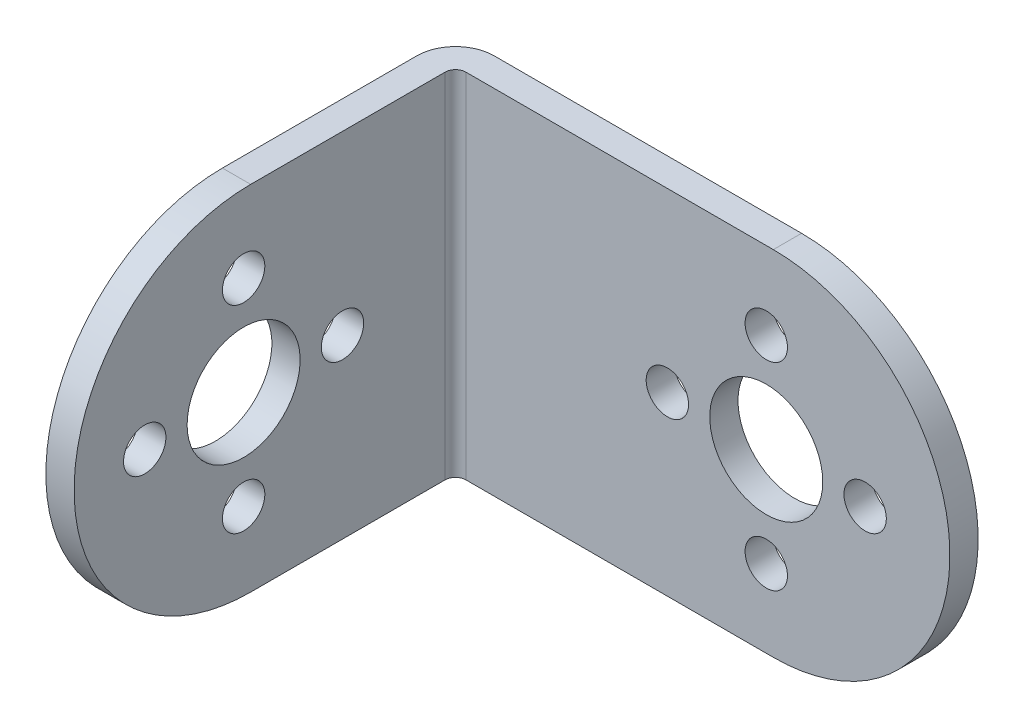
ISO-10303-21;
HEADER;
FILE_DESCRIPTION(('STEP AP214'),'2;1');
FILE_NAME('part.step','',(''),(''),'','','');
FILE_SCHEMA(('AUTOMOTIVE_DESIGN { 1 0 10303 214 1 1 1 1 }'));
ENDSEC;
DATA;
#1=APPLICATION_CONTEXT('core data for automotive mechanical design processes');
#2=APPLICATION_PROTOCOL_DEFINITION('international standard','automotive_design',2000,#1);
#3=PRODUCT_CONTEXT('',#1,'mechanical');
#4=PRODUCT('Part','Part','',(#3));
#5=PRODUCT_RELATED_PRODUCT_CATEGORY('part','',(#4));
#6=PRODUCT_DEFINITION_FORMATION('','',#4);
#7=PRODUCT_DEFINITION_CONTEXT('part definition',#1,'design');
#8=PRODUCT_DEFINITION('design','',#6,#7);
#9=PRODUCT_DEFINITION_SHAPE('','',#8);
#10=(LENGTH_UNIT() NAMED_UNIT(*) SI_UNIT(.MILLI.,.METRE.));
#11=(NAMED_UNIT(*) PLANE_ANGLE_UNIT() SI_UNIT($,.RADIAN.));
#12=(NAMED_UNIT(*) SI_UNIT($,.STERADIAN.) SOLID_ANGLE_UNIT());
#13=UNCERTAINTY_MEASURE_WITH_UNIT(LENGTH_MEASURE(1.E-05),#10,'distance_accuracy_value','');
#14=(GEOMETRIC_REPRESENTATION_CONTEXT(3) GLOBAL_UNCERTAINTY_ASSIGNED_CONTEXT((#13)) GLOBAL_UNIT_ASSIGNED_CONTEXT((#10,
#11,#12)) REPRESENTATION_CONTEXT('',''));
#15=CARTESIAN_POINT('',(0.,0.,0.));
#16=DIRECTION('',(0.,0.,1.));
#17=DIRECTION('',(1.,0.,0.));
#18=AXIS2_PLACEMENT_3D('',#15,#16,#17);
#19=CARTESIAN_POINT('',(2.,0.,0.));
#20=DIRECTION('',(-1.,0.,0.));
#21=DIRECTION('',(0.,0.,1.));
#22=AXIS2_PLACEMENT_3D('',#19,#20,#21);
#23=PLANE('',#22);
#24=CARTESIAN_POINT('',(1.99999999999995,-12.5,14.5));
#25=DIRECTION('',(-1.,0.,0.));
#26=DIRECTION('',(0.,0.,1.));
#27=AXIS2_PLACEMENT_3D('',#24,#25,#26);
#28=CIRCLE('',#27,12.5);
#29=CARTESIAN_POINT('',(1.99999999999997,-25.,14.5));
#30=VERTEX_POINT('',#29);
#31=CARTESIAN_POINT('',(1.99999999999995,0.,14.5));
#32=VERTEX_POINT('',#31);
#33=EDGE_CURVE('E79',#30,#32,#28,.T.);
#34=ORIENTED_EDGE('',*,*,#33,.F.);
#35=DIRECTION('',(0.,0.,-1.));
#36=VECTOR('',#35,1.);
#37=CARTESIAN_POINT('',(2.,-25.,0.));
#38=LINE('',#37,#36);
#39=CARTESIAN_POINT('',(2.,-25.,0.736599999999995));
#40=VERTEX_POINT('',#39);
#41=EDGE_CURVE('E84',#40,#30,#38,.F.);
#42=ORIENTED_EDGE('',*,*,#41,.F.);
#43=DIRECTION('',(0.,-1.,0.));
#44=VECTOR('',#43,1.);
#45=CARTESIAN_POINT('',(2.,-25.,0.736599999999997));
#46=LINE('',#45,#44);
#47=CARTESIAN_POINT('',(1.99999999999997,0.,0.736599999999995));
#48=VERTEX_POINT('',#47);
#49=EDGE_CURVE('E174',#40,#48,#46,.F.);
#50=ORIENTED_EDGE('',*,*,#49,.T.);
#51=DIRECTION('',(0.,0.,1.));
#52=VECTOR('',#51,1.);
#53=CARTESIAN_POINT('',(1.99999999999995,0.,28.));
#54=LINE('',#53,#52);
#55=EDGE_CURVE('E87',#32,#48,#54,.F.);
#56=ORIENTED_EDGE('',*,*,#55,.F.);
#57=EDGE_LOOP('',(#34,#42,#50,#56));
#58=FACE_BOUND('',#57,.T.);
#59=CARTESIAN_POINT('',(1.99999999999995,-19.5,15.));
#60=DIRECTION('',(-1.,0.,0.));
#61=DIRECTION('',(0.,0.,1.));
#62=AXIS2_PLACEMENT_3D('',#59,#60,#61);
#63=CIRCLE('',#62,1.5);
#64=CARTESIAN_POINT('',(1.99999999999994,-19.5,16.5));
#65=VERTEX_POINT('',#64);
#66=EDGE_CURVE('E100',#65,#65,#63,.T.);
#67=ORIENTED_EDGE('',*,*,#66,.T.);
#68=EDGE_LOOP('',(#67));
#69=FACE_BOUND('',#68,.T.);
#70=CARTESIAN_POINT('',(1.99999999999992,-12.5,22.));
#71=DIRECTION('',(-1.,0.,0.));
#72=DIRECTION('',(0.,0.,1.));
#73=AXIS2_PLACEMENT_3D('',#70,#71,#72);
#74=CIRCLE('',#73,1.5);
#75=CARTESIAN_POINT('',(1.99999999999992,-12.5,23.5));
#76=VERTEX_POINT('',#75);
#77=EDGE_CURVE('E178',#76,#76,#74,.T.);
#78=ORIENTED_EDGE('',*,*,#77,.T.);
#79=EDGE_LOOP('',(#78));
#80=FACE_BOUND('',#79,.T.);
#81=CARTESIAN_POINT('',(1.99999999999995,-12.5,15.));
#82=DIRECTION('',(-1.,0.,0.));
#83=DIRECTION('',(0.,0.,1.));
#84=AXIS2_PLACEMENT_3D('',#81,#82,#83);
#85=CIRCLE('',#84,4.);
#86=CARTESIAN_POINT('',(1.99999999999993,-12.5,19.));
#87=VERTEX_POINT('',#86);
#88=EDGE_CURVE('E181',#87,#87,#85,.T.);
#89=ORIENTED_EDGE('',*,*,#88,.T.);
#90=EDGE_LOOP('',(#89));
#91=FACE_BOUND('',#90,.T.);
#92=CARTESIAN_POINT('',(1.99999999999997,-12.5,8.));
#93=DIRECTION('',(-1.,0.,0.));
#94=DIRECTION('',(0.,0.,1.));
#95=AXIS2_PLACEMENT_3D('',#92,#93,#94);
#96=CIRCLE('',#95,1.5);
#97=CARTESIAN_POINT('',(1.99999999999997,-12.5,9.5));
#98=VERTEX_POINT('',#97);
#99=EDGE_CURVE('E183',#98,#98,#96,.T.);
#100=ORIENTED_EDGE('',*,*,#99,.T.);
#101=EDGE_LOOP('',(#100));
#102=FACE_BOUND('',#101,.T.);
#103=CARTESIAN_POINT('',(1.99999999999995,-5.5,15.));
#104=DIRECTION('',(-1.,0.,0.));
#105=DIRECTION('',(0.,0.,1.));
#106=AXIS2_PLACEMENT_3D('',#103,#104,#105);
#107=CIRCLE('',#106,1.5);
#108=CARTESIAN_POINT('',(1.99999999999994,-5.5,16.5));
#109=VERTEX_POINT('',#108);
#110=EDGE_CURVE('E20',#109,#109,#107,.T.);
#111=ORIENTED_EDGE('',*,*,#110,.T.);
#112=EDGE_LOOP('',(#111));
#113=FACE_BOUND('',#112,.T.);
#114=ADVANCED_FACE('F17',(#58,#69,#80,#91,#102,#113),#23,.F.);
#115=CARTESIAN_POINT('',(0.,-5.5,15.));
#116=DIRECTION('',(-1.,0.,0.));
#117=DIRECTION('',(0.,0.,1.));
#118=AXIS2_PLACEMENT_3D('',#115,#116,#117);
#119=CYLINDRICAL_SURFACE('',#118,1.5);
#120=CARTESIAN_POINT('',(0.,-5.5,15.));
#121=DIRECTION('',(-1.,0.,0.));
#122=DIRECTION('',(0.,0.,1.));
#123=AXIS2_PLACEMENT_3D('',#120,#121,#122);
#124=CIRCLE('',#123,1.5);
#125=CARTESIAN_POINT('',(0.,-5.5,16.5));
#126=VERTEX_POINT('',#125);
#127=EDGE_CURVE('E171',#126,#126,#124,.F.);
#128=ORIENTED_EDGE('',*,*,#127,.F.);
#129=EDGE_LOOP('',(#128));
#130=FACE_BOUND('',#129,.T.);
#131=ORIENTED_EDGE('',*,*,#110,.F.);
#132=EDGE_LOOP('',(#131));
#133=FACE_BOUND('',#132,.T.);
#134=ADVANCED_FACE('F191',(#130,#133),#119,.F.);
#135=CARTESIAN_POINT('',(0.,-12.5,7.99999999999999));
#136=DIRECTION('',(-1.,0.,0.));
#137=DIRECTION('',(0.,0.,1.));
#138=AXIS2_PLACEMENT_3D('',#135,#136,#137);
#139=CYLINDRICAL_SURFACE('',#138,1.5);
#140=CARTESIAN_POINT('',(0.,-12.5,7.99999999999999));
#141=DIRECTION('',(-1.,0.,0.));
#142=DIRECTION('',(0.,0.,1.));
#143=AXIS2_PLACEMENT_3D('',#140,#141,#142);
#144=CIRCLE('',#143,1.5);
#145=CARTESIAN_POINT('',(0.,-12.5,9.49999999999999));
#146=VERTEX_POINT('',#145);
#147=EDGE_CURVE('E168',#146,#146,#144,.F.);
#148=ORIENTED_EDGE('',*,*,#147,.F.);
#149=EDGE_LOOP('',(#148));
#150=FACE_BOUND('',#149,.T.);
#151=ORIENTED_EDGE('',*,*,#99,.F.);
#152=EDGE_LOOP('',(#151));
#153=FACE_BOUND('',#152,.T.);
#154=ADVANCED_FACE('F193',(#150,#153),#139,.F.);
#155=CARTESIAN_POINT('',(0.,-12.5,15.));
#156=DIRECTION('',(-1.,0.,0.));
#157=DIRECTION('',(0.,0.,1.));
#158=AXIS2_PLACEMENT_3D('',#155,#156,#157);
#159=CYLINDRICAL_SURFACE('',#158,4.);
#160=CARTESIAN_POINT('',(0.,-12.5,15.));
#161=DIRECTION('',(-1.,0.,0.));
#162=DIRECTION('',(0.,0.,1.));
#163=AXIS2_PLACEMENT_3D('',#160,#161,#162);
#164=CIRCLE('',#163,4.);
#165=CARTESIAN_POINT('',(0.,-12.5,19.));
#166=VERTEX_POINT('',#165);
#167=EDGE_CURVE('E165',#166,#166,#164,.F.);
#168=ORIENTED_EDGE('',*,*,#167,.F.);
#169=EDGE_LOOP('',(#168));
#170=FACE_BOUND('',#169,.T.);
#171=ORIENTED_EDGE('',*,*,#88,.F.);
#172=EDGE_LOOP('',(#171));
#173=FACE_BOUND('',#172,.T.);
#174=ADVANCED_FACE('F200',(#170,#173),#159,.F.);
#175=CARTESIAN_POINT('',(0.,-12.5,22.));
#176=DIRECTION('',(-1.,0.,0.));
#177=DIRECTION('',(0.,0.,1.));
#178=AXIS2_PLACEMENT_3D('',#175,#176,#177);
#179=CYLINDRICAL_SURFACE('',#178,1.5);
#180=CARTESIAN_POINT('',(0.,-12.5,22.));
#181=DIRECTION('',(-1.,0.,0.));
#182=DIRECTION('',(0.,0.,1.));
#183=AXIS2_PLACEMENT_3D('',#180,#181,#182);
#184=CIRCLE('',#183,1.5);
#185=CARTESIAN_POINT('',(0.,-12.5,23.5));
#186=VERTEX_POINT('',#185);
#187=EDGE_CURVE('E162',#186,#186,#184,.F.);
#188=ORIENTED_EDGE('',*,*,#187,.F.);
#189=EDGE_LOOP('',(#188));
#190=FACE_BOUND('',#189,.T.);
#191=ORIENTED_EDGE('',*,*,#77,.F.);
#192=EDGE_LOOP('',(#191));
#193=FACE_BOUND('',#192,.T.);
#194=ADVANCED_FACE('F262',(#190,#193),#179,.F.);
#195=CARTESIAN_POINT('',(0.,-19.5,15.));
#196=DIRECTION('',(-1.,0.,0.));
#197=DIRECTION('',(0.,0.,1.));
#198=AXIS2_PLACEMENT_3D('',#195,#196,#197);
#199=CYLINDRICAL_SURFACE('',#198,1.5);
#200=CARTESIAN_POINT('',(0.,-19.5,15.));
#201=DIRECTION('',(-1.,0.,0.));
#202=DIRECTION('',(0.,0.,1.));
#203=AXIS2_PLACEMENT_3D('',#200,#201,#202);
#204=CIRCLE('',#203,1.5);
#205=CARTESIAN_POINT('',(0.,-19.5,16.5));
#206=VERTEX_POINT('',#205);
#207=EDGE_CURVE('E159',#206,#206,#204,.F.);
#208=ORIENTED_EDGE('',*,*,#207,.F.);
#209=EDGE_LOOP('',(#208));
#210=FACE_BOUND('',#209,.T.);
#211=ORIENTED_EDGE('',*,*,#66,.F.);
#212=EDGE_LOOP('',(#211));
#213=FACE_BOUND('',#212,.T.);
#214=ADVANCED_FACE('F259',(#210,#213),#199,.F.);
#215=CARTESIAN_POINT('',(1.99999999999995,-12.5,14.5));
#216=DIRECTION('',(-1.,0.,0.));
#217=DIRECTION('',(0.,0.,1.));
#218=AXIS2_PLACEMENT_3D('',#215,#216,#217);
#219=CYLINDRICAL_SURFACE('',#218,12.5);
#220=DIRECTION('',(1.,0.,0.));
#221=VECTOR('',#220,1.);
#222=CARTESIAN_POINT('',(0.,0.,14.5));
#223=LINE('',#222,#221);
#224=CARTESIAN_POINT('',(0.,0.,14.5));
#225=VERTEX_POINT('',#224);
#226=EDGE_CURVE('E89',#225,#32,#223,.T.);
#227=ORIENTED_EDGE('',*,*,#226,.F.);
#228=CARTESIAN_POINT('',(0.,-12.5,14.5));
#229=DIRECTION('',(-1.,0.,0.));
#230=DIRECTION('',(0.,0.,1.));
#231=AXIS2_PLACEMENT_3D('',#228,#229,#230);
#232=CIRCLE('',#231,12.5);
#233=CARTESIAN_POINT('',(0.,-25.,14.5));
#234=VERTEX_POINT('',#233);
#235=EDGE_CURVE('E104',#234,#225,#232,.T.);
#236=ORIENTED_EDGE('',*,*,#235,.F.);
#237=DIRECTION('',(-1.,0.,0.));
#238=VECTOR('',#237,1.);
#239=CARTESIAN_POINT('',(1.99999999999995,-25.,14.5));
#240=LINE('',#239,#238);
#241=EDGE_CURVE('E90',#234,#30,#240,.F.);
#242=ORIENTED_EDGE('',*,*,#241,.T.);
#243=ORIENTED_EDGE('',*,*,#33,.T.);
#244=EDGE_LOOP('',(#227,#236,#242,#243));
#245=FACE_BOUND('',#244,.T.);
#246=ADVANCED_FACE('F102',(#245),#219,.T.);
#247=CARTESIAN_POINT('',(2.7366,-25.,0.7366));
#248=DIRECTION('',(0.,-1.,0.));
#249=DIRECTION('',(0.,0.,-1.));
#250=AXIS2_PLACEMENT_3D('',#247,#248,#249);
#251=CYLINDRICAL_SURFACE('',#250,0.7366);
#252=CARTESIAN_POINT('',(2.7366,0.,0.7366));
#253=DIRECTION('',(0.,-1.,0.));
#254=DIRECTION('',(0.,0.,-1.));
#255=AXIS2_PLACEMENT_3D('',#252,#253,#254);
#256=CIRCLE('',#255,0.7366);
#257=CARTESIAN_POINT('',(2.7366,0.,0.));
#258=VERTEX_POINT('',#257);
#259=EDGE_CURVE('E153',#48,#258,#256,.T.);
#260=ORIENTED_EDGE('',*,*,#259,.F.);
#261=ORIENTED_EDGE('',*,*,#49,.F.);
#262=CARTESIAN_POINT('',(2.7366,-25.,0.7366));
#263=DIRECTION('',(0.,-1.,0.));
#264=DIRECTION('',(0.,0.,-1.));
#265=AXIS2_PLACEMENT_3D('',#262,#263,#264);
#266=CIRCLE('',#265,0.7366);
#267=CARTESIAN_POINT('',(2.7366,-25.,0.));
#268=VERTEX_POINT('',#267);
#269=EDGE_CURVE('E99',#40,#268,#266,.T.);
#270=ORIENTED_EDGE('',*,*,#269,.T.);
#271=DIRECTION('',(0.,1.,0.));
#272=VECTOR('',#271,1.);
#273=CARTESIAN_POINT('',(2.7366,-12.5,0.));
#274=LINE('',#273,#272);
#275=EDGE_CURVE('E152',#268,#258,#274,.T.);
#276=ORIENTED_EDGE('',*,*,#275,.T.);
#277=EDGE_LOOP('',(#260,#261,#270,#276));
#278=FACE_BOUND('',#277,.T.);
#279=ADVANCED_FACE('F252',(#278),#251,.F.);
#280=CARTESIAN_POINT('',(0.,0.,0.));
#281=DIRECTION('',(-1.,0.,0.));
#282=DIRECTION('',(0.,0.,1.));
#283=AXIS2_PLACEMENT_3D('',#280,#281,#282);
#284=PLANE('',#283);
#285=DIRECTION('',(0.,0.,1.));
#286=VECTOR('',#285,1.);
#287=CARTESIAN_POINT('',(0.,0.,0.));
#288=LINE('',#287,#286);
#289=CARTESIAN_POINT('',(0.,0.,0.736599999999991));
#290=VERTEX_POINT('',#289);
#291=EDGE_CURVE('E156',#225,#290,#288,.F.);
#292=ORIENTED_EDGE('',*,*,#291,.T.);
#293=DIRECTION('',(0.,-1.,0.));
#294=VECTOR('',#293,1.);
#295=CARTESIAN_POINT('',(0.,-25.,0.736599999999991));
#296=LINE('',#295,#294);
#297=CARTESIAN_POINT('',(0.,-25.,0.736599999999991));
#298=VERTEX_POINT('',#297);
#299=EDGE_CURVE('E132',#298,#290,#296,.F.);
#300=ORIENTED_EDGE('',*,*,#299,.F.);
#301=DIRECTION('',(0.,0.,1.));
#302=VECTOR('',#301,1.);
#303=CARTESIAN_POINT('',(0.,-25.,0.));
#304=LINE('',#303,#302);
#305=EDGE_CURVE('E158',#298,#234,#304,.T.);
#306=ORIENTED_EDGE('',*,*,#305,.T.);
#307=ORIENTED_EDGE('',*,*,#235,.T.);
#308=EDGE_LOOP('',(#292,#300,#306,#307));
#309=FACE_BOUND('',#308,.T.);
#310=ORIENTED_EDGE('',*,*,#207,.T.);
#311=EDGE_LOOP('',(#310));
#312=FACE_BOUND('',#311,.T.);
#313=ORIENTED_EDGE('',*,*,#187,.T.);
#314=EDGE_LOOP('',(#313));
#315=FACE_BOUND('',#314,.T.);
#316=ORIENTED_EDGE('',*,*,#167,.T.);
#317=EDGE_LOOP('',(#316));
#318=FACE_BOUND('',#317,.T.);
#319=ORIENTED_EDGE('',*,*,#147,.T.);
#320=EDGE_LOOP('',(#319));
#321=FACE_BOUND('',#320,.T.);
#322=ORIENTED_EDGE('',*,*,#127,.T.);
#323=EDGE_LOOP('',(#322));
#324=FACE_BOUND('',#323,.T.);
#325=ADVANCED_FACE('F248',(#309,#312,#315,#318,#321,#324),#284,.T.);
#326=CARTESIAN_POINT('',(24.5,-12.5,0.));
#327=DIRECTION('',(0.,0.,-1.));
#328=DIRECTION('',(-1.,0.,0.));
#329=AXIS2_PLACEMENT_3D('',#326,#327,#328);
#330=PLANE('',#329);
#331=DIRECTION('',(1.,0.,0.));
#332=VECTOR('',#331,1.);
#333=CARTESIAN_POINT('',(0.,-25.,0.));
#334=LINE('',#333,#332);
#335=CARTESIAN_POINT('',(24.5,-25.,0.));
#336=VERTEX_POINT('',#335);
#337=EDGE_CURVE('E136',#336,#268,#334,.F.);
#338=ORIENTED_EDGE('',*,*,#337,.F.);
#339=CARTESIAN_POINT('',(24.5,-12.5,0.));
#340=DIRECTION('',(0.,0.,1.));
#341=DIRECTION('',(1.,0.,0.));
#342=AXIS2_PLACEMENT_3D('',#339,#340,#341);
#343=CIRCLE('',#342,12.5);
#344=CARTESIAN_POINT('',(24.5,0.,0.));
#345=VERTEX_POINT('',#344);
#346=EDGE_CURVE('E126',#345,#336,#343,.F.);
#347=ORIENTED_EDGE('',*,*,#346,.F.);
#348=DIRECTION('',(1.,0.,0.));
#349=VECTOR('',#348,1.);
#350=CARTESIAN_POINT('',(0.,0.,0.));
#351=LINE('',#350,#349);
#352=EDGE_CURVE('E131',#258,#345,#351,.T.);
#353=ORIENTED_EDGE('',*,*,#352,.F.);
#354=ORIENTED_EDGE('',*,*,#275,.F.);
#355=EDGE_LOOP('',(#338,#347,#353,#354));
#356=FACE_BOUND('',#355,.T.);
#357=CARTESIAN_POINT('',(24.,-5.5,0.));
#358=DIRECTION('',(0.,0.,1.));
#359=DIRECTION('',(1.,0.,0.));
#360=AXIS2_PLACEMENT_3D('',#357,#358,#359);
#361=CIRCLE('',#360,1.5);
#362=CARTESIAN_POINT('',(25.5,-5.5,0.));
#363=VERTEX_POINT('',#362);
#364=EDGE_CURVE('E137',#363,#363,#361,.F.);
#365=ORIENTED_EDGE('',*,*,#364,.T.);
#366=EDGE_LOOP('',(#365));
#367=FACE_BOUND('',#366,.T.);
#368=CARTESIAN_POINT('',(24.,-19.5,0.));
#369=DIRECTION('',(0.,0.,1.));
#370=DIRECTION('',(1.,0.,0.));
#371=AXIS2_PLACEMENT_3D('',#368,#369,#370);
#372=CIRCLE('',#371,1.5);
#373=CARTESIAN_POINT('',(25.5,-19.5,0.));
#374=VERTEX_POINT('',#373);
#375=EDGE_CURVE('E140',#374,#374,#372,.F.);
#376=ORIENTED_EDGE('',*,*,#375,.T.);
#377=EDGE_LOOP('',(#376));
#378=FACE_BOUND('',#377,.T.);
#379=CARTESIAN_POINT('',(31.,-12.5,0.));
#380=DIRECTION('',(0.,0.,1.));
#381=DIRECTION('',(1.,0.,0.));
#382=AXIS2_PLACEMENT_3D('',#379,#380,#381);
#383=CIRCLE('',#382,1.5);
#384=CARTESIAN_POINT('',(32.5,-12.5,0.));
#385=VERTEX_POINT('',#384);
#386=EDGE_CURVE('E143',#385,#385,#383,.F.);
#387=ORIENTED_EDGE('',*,*,#386,.T.);
#388=EDGE_LOOP('',(#387));
#389=FACE_BOUND('',#388,.T.);
#390=CARTESIAN_POINT('',(17.,-12.5,0.));
#391=DIRECTION('',(0.,0.,1.));
#392=DIRECTION('',(1.,0.,0.));
#393=AXIS2_PLACEMENT_3D('',#390,#391,#392);
#394=CIRCLE('',#393,1.5);
#395=CARTESIAN_POINT('',(18.5,-12.5,0.));
#396=VERTEX_POINT('',#395);
#397=EDGE_CURVE('E146',#396,#396,#394,.F.);
#398=ORIENTED_EDGE('',*,*,#397,.T.);
#399=EDGE_LOOP('',(#398));
#400=FACE_BOUND('',#399,.T.);
#401=CARTESIAN_POINT('',(24.,-12.5,0.));
#402=DIRECTION('',(0.,0.,1.));
#403=DIRECTION('',(1.,0.,0.));
#404=AXIS2_PLACEMENT_3D('',#401,#402,#403);
#405=CIRCLE('',#404,4.);
#406=CARTESIAN_POINT('',(28.,-12.5,0.));
#407=VERTEX_POINT('',#406);
#408=EDGE_CURVE('E149',#407,#407,#405,.F.);
#409=ORIENTED_EDGE('',*,*,#408,.T.);
#410=EDGE_LOOP('',(#409));
#411=FACE_BOUND('',#410,.T.);
#412=ADVANCED_FACE('F244',(#356,#367,#378,#389,#400,#411),#330,.F.);
#413=CARTESIAN_POINT('',(24.,-12.5,-2.));
#414=DIRECTION('',(0.,0.,1.));
#415=DIRECTION('',(1.,0.,0.));
#416=AXIS2_PLACEMENT_3D('',#413,#414,#415);
#417=CYLINDRICAL_SURFACE('',#416,4.);
#418=ORIENTED_EDGE('',*,*,#408,.F.);
#419=EDGE_LOOP('',(#418));
#420=FACE_BOUND('',#419,.T.);
#421=CARTESIAN_POINT('',(24.,-12.5,-2.));
#422=DIRECTION('',(0.,0.,1.));
#423=DIRECTION('',(1.,0.,0.));
#424=AXIS2_PLACEMENT_3D('',#421,#422,#423);
#425=CIRCLE('',#424,4.);
#426=CARTESIAN_POINT('',(28.,-12.5,-2.));
#427=VERTEX_POINT('',#426);
#428=EDGE_CURVE('E122',#427,#427,#425,.T.);
#429=ORIENTED_EDGE('',*,*,#428,.F.);
#430=EDGE_LOOP('',(#429));
#431=FACE_BOUND('',#430,.T.);
#432=ADVANCED_FACE('F240',(#420,#431),#417,.F.);
#433=CARTESIAN_POINT('',(17.,-12.5,-2.));
#434=DIRECTION('',(0.,0.,1.));
#435=DIRECTION('',(1.,0.,0.));
#436=AXIS2_PLACEMENT_3D('',#433,#434,#435);
#437=CYLINDRICAL_SURFACE('',#436,1.5);
#438=ORIENTED_EDGE('',*,*,#397,.F.);
#439=EDGE_LOOP('',(#438));
#440=FACE_BOUND('',#439,.T.);
#441=CARTESIAN_POINT('',(17.,-12.5,-2.));
#442=DIRECTION('',(0.,0.,1.));
#443=DIRECTION('',(1.,0.,0.));
#444=AXIS2_PLACEMENT_3D('',#441,#442,#443);
#445=CIRCLE('',#444,1.5);
#446=CARTESIAN_POINT('',(18.5,-12.5,-2.));
#447=VERTEX_POINT('',#446);
#448=EDGE_CURVE('E119',#447,#447,#445,.T.);
#449=ORIENTED_EDGE('',*,*,#448,.F.);
#450=EDGE_LOOP('',(#449));
#451=FACE_BOUND('',#450,.T.);
#452=ADVANCED_FACE('F236',(#440,#451),#437,.F.);
#453=CARTESIAN_POINT('',(31.,-12.5,-2.));
#454=DIRECTION('',(0.,0.,1.));
#455=DIRECTION('',(1.,0.,0.));
#456=AXIS2_PLACEMENT_3D('',#453,#454,#455);
#457=CYLINDRICAL_SURFACE('',#456,1.5);
#458=ORIENTED_EDGE('',*,*,#386,.F.);
#459=EDGE_LOOP('',(#458));
#460=FACE_BOUND('',#459,.T.);
#461=CARTESIAN_POINT('',(31.,-12.5,-2.));
#462=DIRECTION('',(0.,0.,1.));
#463=DIRECTION('',(1.,0.,0.));
#464=AXIS2_PLACEMENT_3D('',#461,#462,#463);
#465=CIRCLE('',#464,1.5);
#466=CARTESIAN_POINT('',(32.5,-12.5,-2.));
#467=VERTEX_POINT('',#466);
#468=EDGE_CURVE('E116',#467,#467,#465,.T.);
#469=ORIENTED_EDGE('',*,*,#468,.F.);
#470=EDGE_LOOP('',(#469));
#471=FACE_BOUND('',#470,.T.);
#472=ADVANCED_FACE('F232',(#460,#471),#457,.F.);
#473=CARTESIAN_POINT('',(24.,-19.5,-2.));
#474=DIRECTION('',(0.,0.,1.));
#475=DIRECTION('',(1.,0.,0.));
#476=AXIS2_PLACEMENT_3D('',#473,#474,#475);
#477=CYLINDRICAL_SURFACE('',#476,1.5);
#478=ORIENTED_EDGE('',*,*,#375,.F.);
#479=EDGE_LOOP('',(#478));
#480=FACE_BOUND('',#479,.T.);
#481=CARTESIAN_POINT('',(24.,-19.5,-2.));
#482=DIRECTION('',(0.,0.,1.));
#483=DIRECTION('',(1.,0.,0.));
#484=AXIS2_PLACEMENT_3D('',#481,#482,#483);
#485=CIRCLE('',#484,1.5);
#486=CARTESIAN_POINT('',(25.5,-19.5,-2.));
#487=VERTEX_POINT('',#486);
#488=EDGE_CURVE('E113',#487,#487,#485,.T.);
#489=ORIENTED_EDGE('',*,*,#488,.F.);
#490=EDGE_LOOP('',(#489));
#491=FACE_BOUND('',#490,.T.);
#492=ADVANCED_FACE('F228',(#480,#491),#477,.F.);
#493=CARTESIAN_POINT('',(24.,-5.5,-2.));
#494=DIRECTION('',(0.,0.,1.));
#495=DIRECTION('',(1.,0.,0.));
#496=AXIS2_PLACEMENT_3D('',#493,#494,#495);
#497=CYLINDRICAL_SURFACE('',#496,1.5);
#498=ORIENTED_EDGE('',*,*,#364,.F.);
#499=EDGE_LOOP('',(#498));
#500=FACE_BOUND('',#499,.T.);
#501=CARTESIAN_POINT('',(24.,-5.5,-2.));
#502=DIRECTION('',(0.,0.,1.));
#503=DIRECTION('',(1.,0.,0.));
#504=AXIS2_PLACEMENT_3D('',#501,#502,#503);
#505=CIRCLE('',#504,1.5);
#506=CARTESIAN_POINT('',(25.5,-5.5,-2.));
#507=VERTEX_POINT('',#506);
#508=EDGE_CURVE('E109',#507,#507,#505,.T.);
#509=ORIENTED_EDGE('',*,*,#508,.F.);
#510=EDGE_LOOP('',(#509));
#511=FACE_BOUND('',#510,.T.);
#512=ADVANCED_FACE('F225',(#500,#511),#497,.F.);
#513=CARTESIAN_POINT('',(0.,-25.,-2.));
#514=DIRECTION('',(0.,-1.,0.));
#515=DIRECTION('',(1.,0.,0.));
#516=AXIS2_PLACEMENT_3D('',#513,#514,#515);
#517=PLANE('',#516);
#518=DIRECTION('',(-1.,0.,0.));
#519=VECTOR('',#518,1.);
#520=CARTESIAN_POINT('',(24.5,-25.,-2.));
#521=LINE('',#520,#519);
#522=CARTESIAN_POINT('',(24.5,-25.,-2.));
#523=VERTEX_POINT('',#522);
#524=CARTESIAN_POINT('',(2.7366,-25.,-2.));
#525=VERTEX_POINT('',#524);
#526=EDGE_CURVE('E112',#523,#525,#521,.T.);
#527=ORIENTED_EDGE('',*,*,#526,.F.);
#528=DIRECTION('',(0.,0.,1.));
#529=VECTOR('',#528,1.);
#530=CARTESIAN_POINT('',(24.5,-25.,-2.));
#531=LINE('',#530,#529);
#532=EDGE_CURVE('E125',#336,#523,#531,.F.);
#533=ORIENTED_EDGE('',*,*,#532,.F.);
#534=ORIENTED_EDGE('',*,*,#337,.T.);
#535=ORIENTED_EDGE('',*,*,#269,.F.);
#536=ORIENTED_EDGE('',*,*,#41,.T.);
#537=ORIENTED_EDGE('',*,*,#241,.F.);
#538=ORIENTED_EDGE('',*,*,#305,.F.);
#539=CARTESIAN_POINT('',(2.7366,-25.,0.7366));
#540=DIRECTION('',(0.,-1.,0.));
#541=DIRECTION('',(0.,0.,-1.));
#542=AXIS2_PLACEMENT_3D('',#539,#540,#541);
#543=CIRCLE('',#542,2.7366);
#544=EDGE_CURVE('E133',#525,#298,#543,.F.);
#545=ORIENTED_EDGE('',*,*,#544,.F.);
#546=EDGE_LOOP('',(#527,#533,#534,#535,#536,#537,#538,#545));
#547=FACE_BOUND('',#546,.T.);
#548=ADVANCED_FACE('F96',(#547),#517,.T.);
#549=CARTESIAN_POINT('',(2.7366,-25.,0.7366));
#550=DIRECTION('',(0.,-1.,0.));
#551=DIRECTION('',(0.,0.,-1.));
#552=AXIS2_PLACEMENT_3D('',#549,#550,#551);
#553=CYLINDRICAL_SURFACE('',#552,2.7366);
#554=ORIENTED_EDGE('',*,*,#299,.T.);
#555=CARTESIAN_POINT('',(2.7366,0.,0.7366));
#556=DIRECTION('',(0.,-1.,0.));
#557=DIRECTION('',(0.,0.,-1.));
#558=AXIS2_PLACEMENT_3D('',#555,#556,#557);
#559=CIRCLE('',#558,2.7366);
#560=CARTESIAN_POINT('',(2.7366,0.,-2.));
#561=VERTEX_POINT('',#560);
#562=EDGE_CURVE('E129',#290,#561,#559,.T.);
#563=ORIENTED_EDGE('',*,*,#562,.T.);
#564=DIRECTION('',(0.,1.,0.));
#565=VECTOR('',#564,1.);
#566=CARTESIAN_POINT('',(2.7366,-12.5,-2.));
#567=LINE('',#566,#565);
#568=EDGE_CURVE('E432',#525,#561,#567,.T.);
#569=ORIENTED_EDGE('',*,*,#568,.F.);
#570=ORIENTED_EDGE('',*,*,#544,.T.);
#571=EDGE_LOOP('',(#554,#563,#569,#570));
#572=FACE_BOUND('',#571,.T.);
#573=ADVANCED_FACE('F219',(#572),#553,.T.);
#574=CARTESIAN_POINT('',(0.,0.,-2.));
#575=DIRECTION('',(0.,1.,0.));
#576=DIRECTION('',(0.,0.,1.));
#577=AXIS2_PLACEMENT_3D('',#574,#575,#576);
#578=PLANE('',#577);
#579=DIRECTION('',(0.,0.,1.));
#580=VECTOR('',#579,1.);
#581=CARTESIAN_POINT('',(24.5,0.,-2.));
#582=LINE('',#581,#580);
#583=CARTESIAN_POINT('',(24.5,0.,-2.));
#584=VERTEX_POINT('',#583);
#585=EDGE_CURVE('E35',#584,#345,#582,.T.);
#586=ORIENTED_EDGE('',*,*,#585,.F.);
#587=DIRECTION('',(-1.,0.,0.));
#588=VECTOR('',#587,1.);
#589=CARTESIAN_POINT('',(24.5,0.,-2.));
#590=LINE('',#589,#588);
#591=EDGE_CURVE('E26',#561,#584,#590,.F.);
#592=ORIENTED_EDGE('',*,*,#591,.F.);
#593=ORIENTED_EDGE('',*,*,#562,.F.);
#594=ORIENTED_EDGE('',*,*,#291,.F.);
#595=ORIENTED_EDGE('',*,*,#226,.T.);
#596=ORIENTED_EDGE('',*,*,#55,.T.);
#597=ORIENTED_EDGE('',*,*,#259,.T.);
#598=ORIENTED_EDGE('',*,*,#352,.T.);
#599=EDGE_LOOP('',(#586,#592,#593,#594,#595,#596,#597,#598));
#600=FACE_BOUND('',#599,.T.);
#601=ADVANCED_FACE('F212',(#600),#578,.T.);
#602=CARTESIAN_POINT('',(24.5,-12.5,-2.));
#603=DIRECTION('',(0.,0.,1.));
#604=DIRECTION('',(1.,0.,0.));
#605=AXIS2_PLACEMENT_3D('',#602,#603,#604);
#606=CYLINDRICAL_SURFACE('',#605,12.5);
#607=ORIENTED_EDGE('',*,*,#346,.T.);
#608=ORIENTED_EDGE('',*,*,#532,.T.);
#609=CARTESIAN_POINT('',(24.5,-12.5,-2.));
#610=DIRECTION('',(0.,0.,1.));
#611=DIRECTION('',(1.,0.,0.));
#612=AXIS2_PLACEMENT_3D('',#609,#610,#611);
#613=CIRCLE('',#612,12.5);
#614=EDGE_CURVE('E11',#584,#523,#613,.F.);
#615=ORIENTED_EDGE('',*,*,#614,.F.);
#616=ORIENTED_EDGE('',*,*,#585,.T.);
#617=EDGE_LOOP('',(#607,#608,#615,#616));
#618=FACE_BOUND('',#617,.T.);
#619=ADVANCED_FACE('F206',(#618),#606,.T.);
#620=CARTESIAN_POINT('',(24.5,-12.5,-2.));
#621=DIRECTION('',(0.,0.,-1.));
#622=DIRECTION('',(-1.,0.,0.));
#623=AXIS2_PLACEMENT_3D('',#620,#621,#622);
#624=PLANE('',#623);
#625=ORIENTED_EDGE('',*,*,#614,.T.);
#626=ORIENTED_EDGE('',*,*,#526,.T.);
#627=ORIENTED_EDGE('',*,*,#568,.T.);
#628=ORIENTED_EDGE('',*,*,#591,.T.);
#629=EDGE_LOOP('',(#625,#626,#627,#628));
#630=FACE_BOUND('',#629,.T.);
#631=ORIENTED_EDGE('',*,*,#508,.T.);
#632=EDGE_LOOP('',(#631));
#633=FACE_BOUND('',#632,.T.);
#634=ORIENTED_EDGE('',*,*,#488,.T.);
#635=EDGE_LOOP('',(#634));
#636=FACE_BOUND('',#635,.T.);
#637=ORIENTED_EDGE('',*,*,#468,.T.);
#638=EDGE_LOOP('',(#637));
#639=FACE_BOUND('',#638,.T.);
#640=ORIENTED_EDGE('',*,*,#448,.T.);
#641=EDGE_LOOP('',(#640));
#642=FACE_BOUND('',#641,.T.);
#643=ORIENTED_EDGE('',*,*,#428,.T.);
#644=EDGE_LOOP('',(#643));
#645=FACE_BOUND('',#644,.T.);
#646=ADVANCED_FACE('F204',(#630,#633,#636,#639,#642,#645),#624,.T.);
#647=CLOSED_SHELL('',(#114,#134,#154,#174,#194,#214,#246,#279,#325,#412,#432,#452,#472,#492,
#512,#548,#573,#601,#619,#646));
#648=MANIFOLD_SOLID_BREP('B1',#647);
#649=ADVANCED_BREP_SHAPE_REPRESENTATION('',(#18,#648),#14);
#650=SHAPE_DEFINITION_REPRESENTATION(#9,#649);
ENDSEC;
END-ISO-10303-21;
